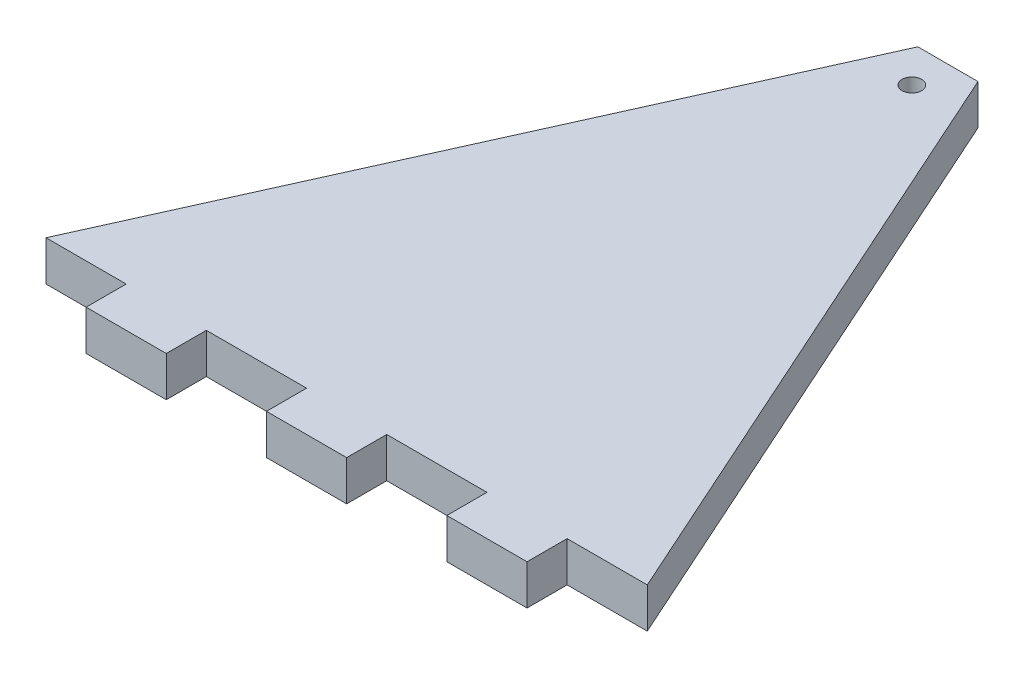
ISO-10303-21;
HEADER;
FILE_DESCRIPTION(('STEP AP214'),'2;1');
FILE_NAME('part.step','',(''),(''),'','','');
FILE_SCHEMA(('AUTOMOTIVE_DESIGN { 1 0 10303 214 1 1 1 1 }'));
ENDSEC;
DATA;
#1=APPLICATION_CONTEXT('core data for automotive mechanical design processes');
#2=APPLICATION_PROTOCOL_DEFINITION('international standard','automotive_design',2000,#1);
#3=PRODUCT_CONTEXT('',#1,'mechanical');
#4=PRODUCT('Part','Part','',(#3));
#5=PRODUCT_RELATED_PRODUCT_CATEGORY('part','',(#4));
#6=PRODUCT_DEFINITION_FORMATION('','',#4);
#7=PRODUCT_DEFINITION_CONTEXT('part definition',#1,'design');
#8=PRODUCT_DEFINITION('design','',#6,#7);
#9=PRODUCT_DEFINITION_SHAPE('','',#8);
#10=(LENGTH_UNIT() NAMED_UNIT(*) SI_UNIT(.MILLI.,.METRE.));
#11=(NAMED_UNIT(*) PLANE_ANGLE_UNIT() SI_UNIT($,.RADIAN.));
#12=(NAMED_UNIT(*) SI_UNIT($,.STERADIAN.) SOLID_ANGLE_UNIT());
#13=UNCERTAINTY_MEASURE_WITH_UNIT(LENGTH_MEASURE(1.E-05),#10,'distance_accuracy_value','');
#14=(GEOMETRIC_REPRESENTATION_CONTEXT(3) GLOBAL_UNCERTAINTY_ASSIGNED_CONTEXT((#13)) GLOBAL_UNIT_ASSIGNED_CONTEXT((#10,
#11,#12)) REPRESENTATION_CONTEXT('',''));
#15=CARTESIAN_POINT('',(0.,0.,0.));
#16=DIRECTION('',(0.,0.,1.));
#17=DIRECTION('',(1.,0.,0.));
#18=AXIS2_PLACEMENT_3D('',#15,#16,#17);
#19=CARTESIAN_POINT('',(0.,10.,75.0000000000004));
#20=DIRECTION('',(0.,0.,1.));
#21=DIRECTION('',(1.,0.,0.));
#22=AXIS2_PLACEMENT_3D('',#19,#20,#21);
#23=PLANE('',#22);
#24=DIRECTION('',(-1.,0.,0.));
#25=VECTOR('',#24,1.);
#26=CARTESIAN_POINT('',(0.,0.,75.0000000000004));
#27=LINE('',#26,#25);
#28=CARTESIAN_POINT('',(-55.,0.,75.0000000000003));
#29=VERTEX_POINT('',#28);
#30=CARTESIAN_POINT('',(-75.,0.,75.0000000000003));
#31=VERTEX_POINT('',#30);
#32=EDGE_CURVE('E184',#29,#31,#27,.T.);
#33=ORIENTED_EDGE('',*,*,#32,.F.);
#34=DIRECTION('',(0.,-1.,0.));
#35=VECTOR('',#34,1.);
#36=CARTESIAN_POINT('',(-55.,10.,75.0000000000003));
#37=LINE('',#36,#35);
#38=CARTESIAN_POINT('',(-55.,10.,75.0000000000003));
#39=VERTEX_POINT('',#38);
#40=EDGE_CURVE('E11',#39,#29,#37,.T.);
#41=ORIENTED_EDGE('',*,*,#40,.F.);
#42=DIRECTION('',(-1.,0.,0.));
#43=VECTOR('',#42,1.);
#44=CARTESIAN_POINT('',(0.,10.,75.0000000000004));
#45=LINE('',#44,#43);
#46=CARTESIAN_POINT('',(-75.,10.,75.0000000000003));
#47=VERTEX_POINT('',#46);
#48=EDGE_CURVE('E331',#39,#47,#45,.T.);
#49=ORIENTED_EDGE('',*,*,#48,.T.);
#50=DIRECTION('',(0.,-1.,0.));
#51=VECTOR('',#50,1.);
#52=CARTESIAN_POINT('',(-75.,10.,75.0000000000003));
#53=LINE('',#52,#51);
#54=EDGE_CURVE('E55',#47,#31,#53,.T.);
#55=ORIENTED_EDGE('',*,*,#54,.T.);
#56=EDGE_LOOP('',(#33,#41,#49,#55));
#57=FACE_BOUND('',#56,.T.);
#58=ADVANCED_FACE('F38',(#57),#23,.T.);
#59=CARTESIAN_POINT('',(-55.,10.,0.));
#60=DIRECTION('',(1.,0.,0.));
#61=DIRECTION('',(0.,0.,-1.));
#62=AXIS2_PLACEMENT_3D('',#59,#60,#61);
#63=PLANE('',#62);
#64=DIRECTION('',(0.,0.,1.));
#65=VECTOR('',#64,1.);
#66=CARTESIAN_POINT('',(-55.,0.,0.));
#67=LINE('',#66,#65);
#68=CARTESIAN_POINT('',(-55.,0.,85.0000000000003));
#69=VERTEX_POINT('',#68);
#70=EDGE_CURVE('E186',#29,#69,#67,.T.);
#71=ORIENTED_EDGE('',*,*,#70,.T.);
#72=DIRECTION('',(0.,-1.,0.));
#73=VECTOR('',#72,1.);
#74=CARTESIAN_POINT('',(-55.,10.,85.0000000000003));
#75=LINE('',#74,#73);
#76=CARTESIAN_POINT('',(-55.,10.,85.0000000000003));
#77=VERTEX_POINT('',#76);
#78=EDGE_CURVE('E47',#77,#69,#75,.T.);
#79=ORIENTED_EDGE('',*,*,#78,.F.);
#80=DIRECTION('',(0.,0.,1.));
#81=VECTOR('',#80,1.);
#82=CARTESIAN_POINT('',(-55.,10.,0.));
#83=LINE('',#82,#81);
#84=EDGE_CURVE('E333',#39,#77,#83,.T.);
#85=ORIENTED_EDGE('',*,*,#84,.F.);
#86=ORIENTED_EDGE('',*,*,#40,.T.);
#87=EDGE_LOOP('',(#71,#79,#85,#86));
#88=FACE_BOUND('',#87,.T.);
#89=ADVANCED_FACE('F263',(#88),#63,.F.);
#90=CARTESIAN_POINT('',(1.17961196366423E-13,10.,85.0000000000002));
#91=DIRECTION('',(0.,0.,-1.));
#92=DIRECTION('',(-1.,0.,0.));
#93=AXIS2_PLACEMENT_3D('',#90,#91,#92);
#94=PLANE('',#93);
#95=DIRECTION('',(1.,0.,0.));
#96=VECTOR('',#95,1.);
#97=CARTESIAN_POINT('',(1.17961196366423E-13,0.,85.0000000000002));
#98=LINE('',#97,#96);
#99=CARTESIAN_POINT('',(-35.,0.,85.0000000000003));
#100=VERTEX_POINT('',#99);
#101=EDGE_CURVE('E189',#69,#100,#98,.T.);
#102=ORIENTED_EDGE('',*,*,#101,.T.);
#103=DIRECTION('',(0.,-1.,0.));
#104=VECTOR('',#103,1.);
#105=CARTESIAN_POINT('',(-35.,10.,85.0000000000003));
#106=LINE('',#105,#104);
#107=CARTESIAN_POINT('',(-35.,10.,85.0000000000003));
#108=VERTEX_POINT('',#107);
#109=EDGE_CURVE('E253',#108,#100,#106,.T.);
#110=ORIENTED_EDGE('',*,*,#109,.F.);
#111=DIRECTION('',(1.,0.,0.));
#112=VECTOR('',#111,1.);
#113=CARTESIAN_POINT('',(1.17961196366423E-13,10.,85.0000000000002));
#114=LINE('',#113,#112);
#115=EDGE_CURVE('E259',#77,#108,#114,.T.);
#116=ORIENTED_EDGE('',*,*,#115,.F.);
#117=ORIENTED_EDGE('',*,*,#78,.T.);
#118=EDGE_LOOP('',(#102,#110,#116,#117));
#119=FACE_BOUND('',#118,.T.);
#120=ADVANCED_FACE('F257',(#119),#94,.F.);
#121=CARTESIAN_POINT('',(-35.,10.,0.));
#122=DIRECTION('',(1.,0.,0.));
#123=DIRECTION('',(0.,0.,-1.));
#124=AXIS2_PLACEMENT_3D('',#121,#122,#123);
#125=PLANE('',#124);
#126=DIRECTION('',(0.,0.,1.));
#127=VECTOR('',#126,1.);
#128=CARTESIAN_POINT('',(-35.,0.,0.));
#129=LINE('',#128,#127);
#130=CARTESIAN_POINT('',(-35.,0.,75.0000000000003));
#131=VERTEX_POINT('',#130);
#132=EDGE_CURVE('E192',#131,#100,#129,.T.);
#133=ORIENTED_EDGE('',*,*,#132,.F.);
#134=DIRECTION('',(0.,-1.,0.));
#135=VECTOR('',#134,1.);
#136=CARTESIAN_POINT('',(-35.,10.,75.0000000000003));
#137=LINE('',#136,#135);
#138=CARTESIAN_POINT('',(-35.,10.,75.0000000000003));
#139=VERTEX_POINT('',#138);
#140=EDGE_CURVE('E251',#139,#131,#137,.T.);
#141=ORIENTED_EDGE('',*,*,#140,.F.);
#142=DIRECTION('',(0.,0.,1.));
#143=VECTOR('',#142,1.);
#144=CARTESIAN_POINT('',(-35.,10.,0.));
#145=LINE('',#144,#143);
#146=EDGE_CURVE('E338',#139,#108,#145,.T.);
#147=ORIENTED_EDGE('',*,*,#146,.T.);
#148=ORIENTED_EDGE('',*,*,#109,.T.);
#149=EDGE_LOOP('',(#133,#141,#147,#148));
#150=FACE_BOUND('',#149,.T.);
#151=ADVANCED_FACE('F274',(#150),#125,.T.);
#152=CARTESIAN_POINT('',(0.,10.,75.0000000000003));
#153=DIRECTION('',(0.,0.,-1.));
#154=DIRECTION('',(-1.,0.,0.));
#155=AXIS2_PLACEMENT_3D('',#152,#153,#154);
#156=PLANE('',#155);
#157=DIRECTION('',(1.,0.,0.));
#158=VECTOR('',#157,1.);
#159=CARTESIAN_POINT('',(0.,0.,75.0000000000003));
#160=LINE('',#159,#158);
#161=CARTESIAN_POINT('',(-9.99999999999998,0.,75.0000000000003));
#162=VERTEX_POINT('',#161);
#163=EDGE_CURVE('E195',#131,#162,#160,.T.);
#164=ORIENTED_EDGE('',*,*,#163,.T.);
#165=DIRECTION('',(0.,-1.,0.));
#166=VECTOR('',#165,1.);
#167=CARTESIAN_POINT('',(-9.99999999999998,10.,75.0000000000003));
#168=LINE('',#167,#166);
#169=CARTESIAN_POINT('',(-9.99999999999998,10.,75.0000000000003));
#170=VERTEX_POINT('',#169);
#171=EDGE_CURVE('E248',#170,#162,#168,.T.);
#172=ORIENTED_EDGE('',*,*,#171,.F.);
#173=DIRECTION('',(1.,0.,0.));
#174=VECTOR('',#173,1.);
#175=CARTESIAN_POINT('',(0.,10.,75.0000000000003));
#176=LINE('',#175,#174);
#177=EDGE_CURVE('E341',#139,#170,#176,.T.);
#178=ORIENTED_EDGE('',*,*,#177,.F.);
#179=ORIENTED_EDGE('',*,*,#140,.T.);
#180=EDGE_LOOP('',(#164,#172,#178,#179));
#181=FACE_BOUND('',#180,.T.);
#182=ADVANCED_FACE('F277',(#181),#156,.F.);
#183=CARTESIAN_POINT('',(-9.99999999999991,10.,0.));
#184=DIRECTION('',(1.,0.,0.));
#185=DIRECTION('',(0.,0.,-1.));
#186=AXIS2_PLACEMENT_3D('',#183,#184,#185);
#187=PLANE('',#186);
#188=DIRECTION('',(0.,0.,1.));
#189=VECTOR('',#188,1.);
#190=CARTESIAN_POINT('',(-9.99999999999991,0.,0.));
#191=LINE('',#190,#189);
#192=CARTESIAN_POINT('',(-9.99999999999999,0.,85.0000000000002));
#193=VERTEX_POINT('',#192);
#194=EDGE_CURVE('E198',#162,#193,#191,.T.);
#195=ORIENTED_EDGE('',*,*,#194,.T.);
#196=DIRECTION('',(0.,-1.,0.));
#197=VECTOR('',#196,1.);
#198=CARTESIAN_POINT('',(-9.99999999999999,10.,85.0000000000002));
#199=LINE('',#198,#197);
#200=CARTESIAN_POINT('',(-9.99999999999999,10.,85.0000000000002));
#201=VERTEX_POINT('',#200);
#202=EDGE_CURVE('E246',#201,#193,#199,.T.);
#203=ORIENTED_EDGE('',*,*,#202,.F.);
#204=DIRECTION('',(0.,0.,1.));
#205=VECTOR('',#204,1.);
#206=CARTESIAN_POINT('',(-9.99999999999991,10.,0.));
#207=LINE('',#206,#205);
#208=EDGE_CURVE('E344',#170,#201,#207,.T.);
#209=ORIENTED_EDGE('',*,*,#208,.F.);
#210=ORIENTED_EDGE('',*,*,#171,.T.);
#211=EDGE_LOOP('',(#195,#203,#209,#210));
#212=FACE_BOUND('',#211,.T.);
#213=ADVANCED_FACE('F281',(#212),#187,.F.);
#214=CARTESIAN_POINT('',(0.,10.,85.0000000000002));
#215=DIRECTION('',(0.,0.,1.));
#216=DIRECTION('',(1.,0.,0.));
#217=AXIS2_PLACEMENT_3D('',#214,#215,#216);
#218=PLANE('',#217);
#219=DIRECTION('',(-1.,0.,0.));
#220=VECTOR('',#219,1.);
#221=CARTESIAN_POINT('',(0.,0.,85.0000000000002));
#222=LINE('',#221,#220);
#223=CARTESIAN_POINT('',(10.,0.,85.0000000000002));
#224=VERTEX_POINT('',#223);
#225=EDGE_CURVE('E201',#224,#193,#222,.T.);
#226=ORIENTED_EDGE('',*,*,#225,.F.);
#227=DIRECTION('',(0.,-1.,0.));
#228=VECTOR('',#227,1.);
#229=CARTESIAN_POINT('',(10.,10.,85.0000000000002));
#230=LINE('',#229,#228);
#231=CARTESIAN_POINT('',(10.,10.,85.0000000000002));
#232=VERTEX_POINT('',#231);
#233=EDGE_CURVE('E244',#232,#224,#230,.T.);
#234=ORIENTED_EDGE('',*,*,#233,.F.);
#235=DIRECTION('',(-1.,0.,0.));
#236=VECTOR('',#235,1.);
#237=CARTESIAN_POINT('',(0.,10.,85.0000000000002));
#238=LINE('',#237,#236);
#239=EDGE_CURVE('E346',#232,#201,#238,.T.);
#240=ORIENTED_EDGE('',*,*,#239,.T.);
#241=ORIENTED_EDGE('',*,*,#202,.T.);
#242=EDGE_LOOP('',(#226,#234,#240,#241));
#243=FACE_BOUND('',#242,.T.);
#244=ADVANCED_FACE('F285',(#243),#218,.T.);
#245=CARTESIAN_POINT('',(10.0000000000001,10.,0.));
#246=DIRECTION('',(1.,0.,0.));
#247=DIRECTION('',(0.,0.,-1.));
#248=AXIS2_PLACEMENT_3D('',#245,#246,#247);
#249=PLANE('',#248);
#250=DIRECTION('',(0.,0.,1.));
#251=VECTOR('',#250,1.);
#252=CARTESIAN_POINT('',(10.0000000000001,0.,0.));
#253=LINE('',#252,#251);
#254=CARTESIAN_POINT('',(10.,0.,75.0000000000003));
#255=VERTEX_POINT('',#254);
#256=EDGE_CURVE('E204',#255,#224,#253,.T.);
#257=ORIENTED_EDGE('',*,*,#256,.F.);
#258=DIRECTION('',(0.,-1.,0.));
#259=VECTOR('',#258,1.);
#260=CARTESIAN_POINT('',(10.,10.,75.0000000000003));
#261=LINE('',#260,#259);
#262=CARTESIAN_POINT('',(10.,10.,75.0000000000003));
#263=VERTEX_POINT('',#262);
#264=EDGE_CURVE('E242',#263,#255,#261,.T.);
#265=ORIENTED_EDGE('',*,*,#264,.F.);
#266=DIRECTION('',(0.,0.,1.));
#267=VECTOR('',#266,1.);
#268=CARTESIAN_POINT('',(10.0000000000001,10.,0.));
#269=LINE('',#268,#267);
#270=EDGE_CURVE('E349',#263,#232,#269,.T.);
#271=ORIENTED_EDGE('',*,*,#270,.T.);
#272=ORIENTED_EDGE('',*,*,#233,.T.);
#273=EDGE_LOOP('',(#257,#265,#271,#272));
#274=FACE_BOUND('',#273,.T.);
#275=ADVANCED_FACE('F289',(#274),#249,.T.);
#276=CARTESIAN_POINT('',(0.,10.,75.0000000000003));
#277=DIRECTION('',(0.,0.,-1.));
#278=DIRECTION('',(-1.,0.,0.));
#279=AXIS2_PLACEMENT_3D('',#276,#277,#278);
#280=PLANE('',#279);
#281=DIRECTION('',(1.,0.,0.));
#282=VECTOR('',#281,1.);
#283=CARTESIAN_POINT('',(0.,0.,75.0000000000003));
#284=LINE('',#283,#282);
#285=CARTESIAN_POINT('',(35.,0.,75.0000000000003));
#286=VERTEX_POINT('',#285);
#287=EDGE_CURVE('E207',#255,#286,#284,.T.);
#288=ORIENTED_EDGE('',*,*,#287,.T.);
#289=DIRECTION('',(0.,-1.,0.));
#290=VECTOR('',#289,1.);
#291=CARTESIAN_POINT('',(35.,10.,75.0000000000003));
#292=LINE('',#291,#290);
#293=CARTESIAN_POINT('',(35.,10.,75.0000000000003));
#294=VERTEX_POINT('',#293);
#295=EDGE_CURVE('E239',#294,#286,#292,.T.);
#296=ORIENTED_EDGE('',*,*,#295,.F.);
#297=DIRECTION('',(1.,0.,0.));
#298=VECTOR('',#297,1.);
#299=CARTESIAN_POINT('',(0.,10.,75.0000000000003));
#300=LINE('',#299,#298);
#301=EDGE_CURVE('E352',#263,#294,#300,.T.);
#302=ORIENTED_EDGE('',*,*,#301,.F.);
#303=ORIENTED_EDGE('',*,*,#264,.T.);
#304=EDGE_LOOP('',(#288,#296,#302,#303));
#305=FACE_BOUND('',#304,.T.);
#306=ADVANCED_FACE('F293',(#305),#280,.F.);
#307=CARTESIAN_POINT('',(35.,10.,0.));
#308=DIRECTION('',(1.,0.,0.));
#309=DIRECTION('',(0.,0.,-1.));
#310=AXIS2_PLACEMENT_3D('',#307,#308,#309);
#311=PLANE('',#310);
#312=DIRECTION('',(0.,0.,1.));
#313=VECTOR('',#312,1.);
#314=CARTESIAN_POINT('',(35.,0.,0.));
#315=LINE('',#314,#313);
#316=CARTESIAN_POINT('',(35.,0.,85.0000000000003));
#317=VERTEX_POINT('',#316);
#318=EDGE_CURVE('E210',#286,#317,#315,.T.);
#319=ORIENTED_EDGE('',*,*,#318,.T.);
#320=DIRECTION('',(0.,-1.,0.));
#321=VECTOR('',#320,1.);
#322=CARTESIAN_POINT('',(35.,10.,85.0000000000003));
#323=LINE('',#322,#321);
#324=CARTESIAN_POINT('',(35.,10.,85.0000000000003));
#325=VERTEX_POINT('',#324);
#326=EDGE_CURVE('E236',#325,#317,#323,.T.);
#327=ORIENTED_EDGE('',*,*,#326,.F.);
#328=DIRECTION('',(0.,0.,1.));
#329=VECTOR('',#328,1.);
#330=CARTESIAN_POINT('',(35.,10.,0.));
#331=LINE('',#330,#329);
#332=EDGE_CURVE('E355',#294,#325,#331,.T.);
#333=ORIENTED_EDGE('',*,*,#332,.F.);
#334=ORIENTED_EDGE('',*,*,#295,.T.);
#335=EDGE_LOOP('',(#319,#327,#333,#334));
#336=FACE_BOUND('',#335,.T.);
#337=ADVANCED_FACE('F297',(#336),#311,.F.);
#338=CARTESIAN_POINT('',(0.,10.,85.0000000000003));
#339=DIRECTION('',(0.,0.,-1.));
#340=DIRECTION('',(-1.,0.,0.));
#341=AXIS2_PLACEMENT_3D('',#338,#339,#340);
#342=PLANE('',#341);
#343=DIRECTION('',(1.,0.,0.));
#344=VECTOR('',#343,1.);
#345=CARTESIAN_POINT('',(0.,0.,85.0000000000003));
#346=LINE('',#345,#344);
#347=CARTESIAN_POINT('',(55.,0.,85.0000000000003));
#348=VERTEX_POINT('',#347);
#349=EDGE_CURVE('E213',#317,#348,#346,.T.);
#350=ORIENTED_EDGE('',*,*,#349,.T.);
#351=DIRECTION('',(0.,-1.,0.));
#352=VECTOR('',#351,1.);
#353=CARTESIAN_POINT('',(55.,10.,85.0000000000003));
#354=LINE('',#353,#352);
#355=CARTESIAN_POINT('',(55.,10.,85.0000000000003));
#356=VERTEX_POINT('',#355);
#357=EDGE_CURVE('E234',#356,#348,#354,.T.);
#358=ORIENTED_EDGE('',*,*,#357,.F.);
#359=DIRECTION('',(1.,0.,0.));
#360=VECTOR('',#359,1.);
#361=CARTESIAN_POINT('',(0.,10.,85.0000000000003));
#362=LINE('',#361,#360);
#363=EDGE_CURVE('E358',#325,#356,#362,.T.);
#364=ORIENTED_EDGE('',*,*,#363,.F.);
#365=ORIENTED_EDGE('',*,*,#326,.T.);
#366=EDGE_LOOP('',(#350,#358,#364,#365));
#367=FACE_BOUND('',#366,.T.);
#368=ADVANCED_FACE('F301',(#367),#342,.F.);
#369=CARTESIAN_POINT('',(55.,10.,0.));
#370=DIRECTION('',(1.,0.,0.));
#371=DIRECTION('',(0.,0.,-1.));
#372=AXIS2_PLACEMENT_3D('',#369,#370,#371);
#373=PLANE('',#372);
#374=DIRECTION('',(0.,0.,1.));
#375=VECTOR('',#374,1.);
#376=CARTESIAN_POINT('',(55.,0.,0.));
#377=LINE('',#376,#375);
#378=CARTESIAN_POINT('',(55.,0.,75.0000000000003));
#379=VERTEX_POINT('',#378);
#380=EDGE_CURVE('E216',#379,#348,#377,.T.);
#381=ORIENTED_EDGE('',*,*,#380,.F.);
#382=DIRECTION('',(0.,-1.,0.));
#383=VECTOR('',#382,1.);
#384=CARTESIAN_POINT('',(55.,10.,75.0000000000003));
#385=LINE('',#384,#383);
#386=CARTESIAN_POINT('',(55.,10.,75.0000000000003));
#387=VERTEX_POINT('',#386);
#388=EDGE_CURVE('E232',#387,#379,#385,.T.);
#389=ORIENTED_EDGE('',*,*,#388,.F.);
#390=DIRECTION('',(0.,0.,1.));
#391=VECTOR('',#390,1.);
#392=CARTESIAN_POINT('',(55.,10.,0.));
#393=LINE('',#392,#391);
#394=EDGE_CURVE('E360',#387,#356,#393,.T.);
#395=ORIENTED_EDGE('',*,*,#394,.T.);
#396=ORIENTED_EDGE('',*,*,#357,.T.);
#397=EDGE_LOOP('',(#381,#389,#395,#396));
#398=FACE_BOUND('',#397,.T.);
#399=ADVANCED_FACE('F305',(#398),#373,.T.);
#400=CARTESIAN_POINT('',(1.56125112837913E-13,10.,75.0000000000004));
#401=DIRECTION('',(0.,0.,-1.));
#402=DIRECTION('',(-1.,0.,0.));
#403=AXIS2_PLACEMENT_3D('',#400,#401,#402);
#404=PLANE('',#403);
#405=DIRECTION('',(1.,0.,0.));
#406=VECTOR('',#405,1.);
#407=CARTESIAN_POINT('',(1.56125112837913E-13,0.,75.0000000000004));
#408=LINE('',#407,#406);
#409=CARTESIAN_POINT('',(75.,0.,75.0000000000003));
#410=VERTEX_POINT('',#409);
#411=EDGE_CURVE('E219',#379,#410,#408,.T.);
#412=ORIENTED_EDGE('',*,*,#411,.T.);
#413=DIRECTION('',(0.,-1.,0.));
#414=VECTOR('',#413,1.);
#415=CARTESIAN_POINT('',(75.,10.,75.0000000000003));
#416=LINE('',#415,#414);
#417=CARTESIAN_POINT('',(75.,10.,75.0000000000003));
#418=VERTEX_POINT('',#417);
#419=EDGE_CURVE('E162',#418,#410,#416,.T.);
#420=ORIENTED_EDGE('',*,*,#419,.F.);
#421=DIRECTION('',(1.,0.,0.));
#422=VECTOR('',#421,1.);
#423=CARTESIAN_POINT('',(1.56125112837913E-13,10.,75.0000000000004));
#424=LINE('',#423,#422);
#425=EDGE_CURVE('E172',#387,#418,#424,.T.);
#426=ORIENTED_EDGE('',*,*,#425,.F.);
#427=ORIENTED_EDGE('',*,*,#388,.T.);
#428=EDGE_LOOP('',(#412,#420,#426,#427));
#429=FACE_BOUND('',#428,.T.);
#430=ADVANCED_FACE('F309',(#429),#404,.F.);
#431=CARTESIAN_POINT('',(34.3035343035342,10.,-15.4365904365904));
#432=DIRECTION('',(0.911921505175106,0.,-0.410364677328798));
#433=DIRECTION('',(-0.410364677328798,0.,-0.911921505175106));
#434=AXIS2_PLACEMENT_3D('',#431,#432,#433);
#435=PLANE('',#434);
#436=DIRECTION('',(0.410364677328798,0.,0.911921505175106));
#437=VECTOR('',#436,1.);
#438=CARTESIAN_POINT('',(34.3035343035342,0.,-15.4365904365904));
#439=LINE('',#438,#437);
#440=CARTESIAN_POINT('',(7.49999999999998,0.,-74.9999999999997));
#441=VERTEX_POINT('',#440);
#442=EDGE_CURVE('E158',#441,#410,#439,.T.);
#443=ORIENTED_EDGE('',*,*,#442,.F.);
#444=DIRECTION('',(0.,-1.,0.));
#445=VECTOR('',#444,1.);
#446=CARTESIAN_POINT('',(7.49999999999998,10.,-74.9999999999997));
#447=LINE('',#446,#445);
#448=CARTESIAN_POINT('',(7.49999999999998,10.,-74.9999999999997));
#449=VERTEX_POINT('',#448);
#450=EDGE_CURVE('E153',#449,#441,#447,.T.);
#451=ORIENTED_EDGE('',*,*,#450,.F.);
#452=DIRECTION('',(0.410364677328798,0.,0.911921505175106));
#453=VECTOR('',#452,1.);
#454=CARTESIAN_POINT('',(34.3035343035342,10.,-15.4365904365904));
#455=LINE('',#454,#453);
#456=EDGE_CURVE('E156',#449,#418,#455,.T.);
#457=ORIENTED_EDGE('',*,*,#456,.T.);
#458=ORIENTED_EDGE('',*,*,#419,.T.);
#459=EDGE_LOOP('',(#443,#451,#457,#458));
#460=FACE_BOUND('',#459,.T.);
#461=ADVANCED_FACE('F155',(#460),#435,.T.);
#462=CARTESIAN_POINT('',(0.,10.,-74.9999999999997));
#463=DIRECTION('',(0.,0.,-1.));
#464=DIRECTION('',(-1.,0.,0.));
#465=AXIS2_PLACEMENT_3D('',#462,#463,#464);
#466=PLANE('',#465);
#467=DIRECTION('',(1.,0.,0.));
#468=VECTOR('',#467,1.);
#469=CARTESIAN_POINT('',(0.,0.,-74.9999999999997));
#470=LINE('',#469,#468);
#471=CARTESIAN_POINT('',(-7.50000000000002,0.,-74.9999999999997));
#472=VERTEX_POINT('',#471);
#473=EDGE_CURVE('E223',#472,#441,#470,.T.);
#474=ORIENTED_EDGE('',*,*,#473,.F.);
#475=DIRECTION('',(0.,-1.,0.));
#476=VECTOR('',#475,1.);
#477=CARTESIAN_POINT('',(-7.50000000000002,10.,-74.9999999999997));
#478=LINE('',#477,#476);
#479=CARTESIAN_POINT('',(-7.50000000000002,10.,-74.9999999999997));
#480=VERTEX_POINT('',#479);
#481=EDGE_CURVE('E104',#480,#472,#478,.T.);
#482=ORIENTED_EDGE('',*,*,#481,.F.);
#483=DIRECTION('',(1.,0.,0.));
#484=VECTOR('',#483,1.);
#485=CARTESIAN_POINT('',(0.,10.,-74.9999999999997));
#486=LINE('',#485,#484);
#487=EDGE_CURVE('E169',#480,#449,#486,.T.);
#488=ORIENTED_EDGE('',*,*,#487,.T.);
#489=ORIENTED_EDGE('',*,*,#450,.T.);
#490=EDGE_LOOP('',(#474,#482,#488,#489));
#491=FACE_BOUND('',#490,.T.);
#492=ADVANCED_FACE('F175',(#491),#466,.T.);
#493=CARTESIAN_POINT('',(0.,10.,-65.9999999999997));
#494=DIRECTION('',(0.,-1.,0.));
#495=DIRECTION('',(0.,0.,-1.));
#496=AXIS2_PLACEMENT_3D('',#493,#494,#495);
#497=CYLINDRICAL_SURFACE('',#496,2.45);
#498=CARTESIAN_POINT('',(0.,10.,-65.9999999999997));
#499=DIRECTION('',(0.,1.,0.));
#500=DIRECTION('',(0.,0.,1.));
#501=AXIS2_PLACEMENT_3D('',#498,#499,#500);
#502=CIRCLE('',#501,2.45);
#503=CARTESIAN_POINT('',(0.,10.,-63.5499999999997));
#504=VERTEX_POINT('',#503);
#505=EDGE_CURVE('E228',#504,#504,#502,.T.);
#506=ORIENTED_EDGE('',*,*,#505,.T.);
#507=EDGE_LOOP('',(#506));
#508=FACE_BOUND('',#507,.T.);
#509=CARTESIAN_POINT('',(0.,0.,-65.9999999999997));
#510=DIRECTION('',(0.,1.,0.));
#511=DIRECTION('',(0.,0.,1.));
#512=AXIS2_PLACEMENT_3D('',#509,#510,#511);
#513=CIRCLE('',#512,2.45);
#514=CARTESIAN_POINT('',(0.,0.,-63.5499999999997));
#515=VERTEX_POINT('',#514);
#516=EDGE_CURVE('E181',#515,#515,#513,.T.);
#517=ORIENTED_EDGE('',*,*,#516,.F.);
#518=EDGE_LOOP('',(#517));
#519=FACE_BOUND('',#518,.T.);
#520=ADVANCED_FACE('F40',(#508,#519),#497,.F.);
#521=CARTESIAN_POINT('',(-34.3035343035342,10.,-15.4365904365904));
#522=DIRECTION('',(-0.911921505175107,0.,-0.410364677328798));
#523=DIRECTION('',(-0.410364677328798,0.,0.911921505175107));
#524=AXIS2_PLACEMENT_3D('',#521,#522,#523);
#525=PLANE('',#524);
#526=DIRECTION('',(0.410364677328798,0.,-0.911921505175107));
#527=VECTOR('',#526,1.);
#528=CARTESIAN_POINT('',(-34.3035343035342,0.,-15.4365904365904));
#529=LINE('',#528,#527);
#530=EDGE_CURVE('E225',#31,#472,#529,.T.);
#531=ORIENTED_EDGE('',*,*,#530,.F.);
#532=ORIENTED_EDGE('',*,*,#54,.F.);
#533=DIRECTION('',(0.410364677328798,0.,-0.911921505175107));
#534=VECTOR('',#533,1.);
#535=CARTESIAN_POINT('',(-34.3035343035342,10.,-15.4365904365904));
#536=LINE('',#535,#534);
#537=EDGE_CURVE('E176',#47,#480,#536,.T.);
#538=ORIENTED_EDGE('',*,*,#537,.T.);
#539=ORIENTED_EDGE('',*,*,#481,.T.);
#540=EDGE_LOOP('',(#531,#532,#538,#539));
#541=FACE_BOUND('',#540,.T.);
#542=ADVANCED_FACE('F318',(#541),#525,.T.);
#543=CARTESIAN_POINT('',(0.,10.,0.));
#544=DIRECTION('',(0.,1.,0.));
#545=DIRECTION('',(0.,0.,1.));
#546=AXIS2_PLACEMENT_3D('',#543,#544,#545);
#547=PLANE('',#546);
#548=ORIENTED_EDGE('',*,*,#505,.F.);
#549=EDGE_LOOP('',(#548));
#550=FACE_BOUND('',#549,.T.);
#551=ORIENTED_EDGE('',*,*,#48,.F.);
#552=ORIENTED_EDGE('',*,*,#84,.T.);
#553=ORIENTED_EDGE('',*,*,#115,.T.);
#554=ORIENTED_EDGE('',*,*,#146,.F.);
#555=ORIENTED_EDGE('',*,*,#177,.T.);
#556=ORIENTED_EDGE('',*,*,#208,.T.);
#557=ORIENTED_EDGE('',*,*,#239,.F.);
#558=ORIENTED_EDGE('',*,*,#270,.F.);
#559=ORIENTED_EDGE('',*,*,#301,.T.);
#560=ORIENTED_EDGE('',*,*,#332,.T.);
#561=ORIENTED_EDGE('',*,*,#363,.T.);
#562=ORIENTED_EDGE('',*,*,#394,.F.);
#563=ORIENTED_EDGE('',*,*,#425,.T.);
#564=ORIENTED_EDGE('',*,*,#456,.F.);
#565=ORIENTED_EDGE('',*,*,#487,.F.);
#566=ORIENTED_EDGE('',*,*,#537,.F.);
#567=EDGE_LOOP('',(#551,#552,#553,#554,#555,#556,#557,#558,#559,#560,#561,#562,#563,#564,#565,#566));
#568=FACE_BOUND('',#567,.T.);
#569=ADVANCED_FACE('F167',(#550,#568),#547,.T.);
#570=CARTESIAN_POINT('',(0.,0.,0.));
#571=DIRECTION('',(0.,1.,0.));
#572=DIRECTION('',(0.,0.,1.));
#573=AXIS2_PLACEMENT_3D('',#570,#571,#572);
#574=PLANE('',#573);
#575=ORIENTED_EDGE('',*,*,#516,.T.);
#576=EDGE_LOOP('',(#575));
#577=FACE_BOUND('',#576,.T.);
#578=ORIENTED_EDGE('',*,*,#32,.T.);
#579=ORIENTED_EDGE('',*,*,#530,.T.);
#580=ORIENTED_EDGE('',*,*,#473,.T.);
#581=ORIENTED_EDGE('',*,*,#442,.T.);
#582=ORIENTED_EDGE('',*,*,#411,.F.);
#583=ORIENTED_EDGE('',*,*,#380,.T.);
#584=ORIENTED_EDGE('',*,*,#349,.F.);
#585=ORIENTED_EDGE('',*,*,#318,.F.);
#586=ORIENTED_EDGE('',*,*,#287,.F.);
#587=ORIENTED_EDGE('',*,*,#256,.T.);
#588=ORIENTED_EDGE('',*,*,#225,.T.);
#589=ORIENTED_EDGE('',*,*,#194,.F.);
#590=ORIENTED_EDGE('',*,*,#163,.F.);
#591=ORIENTED_EDGE('',*,*,#132,.T.);
#592=ORIENTED_EDGE('',*,*,#101,.F.);
#593=ORIENTED_EDGE('',*,*,#70,.F.);
#594=EDGE_LOOP('',(#578,#579,#580,#581,#582,#583,#584,#585,#586,#587,#588,#589,#590,#591,#592,#593));
#595=FACE_BOUND('',#594,.T.);
#596=ADVANCED_FACE('F265',(#577,#595),#574,.F.);
#597=CLOSED_SHELL('',(#58,#89,#120,#151,#182,#213,#244,#275,#306,#337,#368,#399,#430,#461,#492,
#520,#542,#569,#596));
#598=MANIFOLD_SOLID_BREP('B2',#597);
#599=ADVANCED_BREP_SHAPE_REPRESENTATION('',(#18,#598),#14);
#600=SHAPE_DEFINITION_REPRESENTATION(#9,#599);
ENDSEC;
END-ISO-10303-21;
